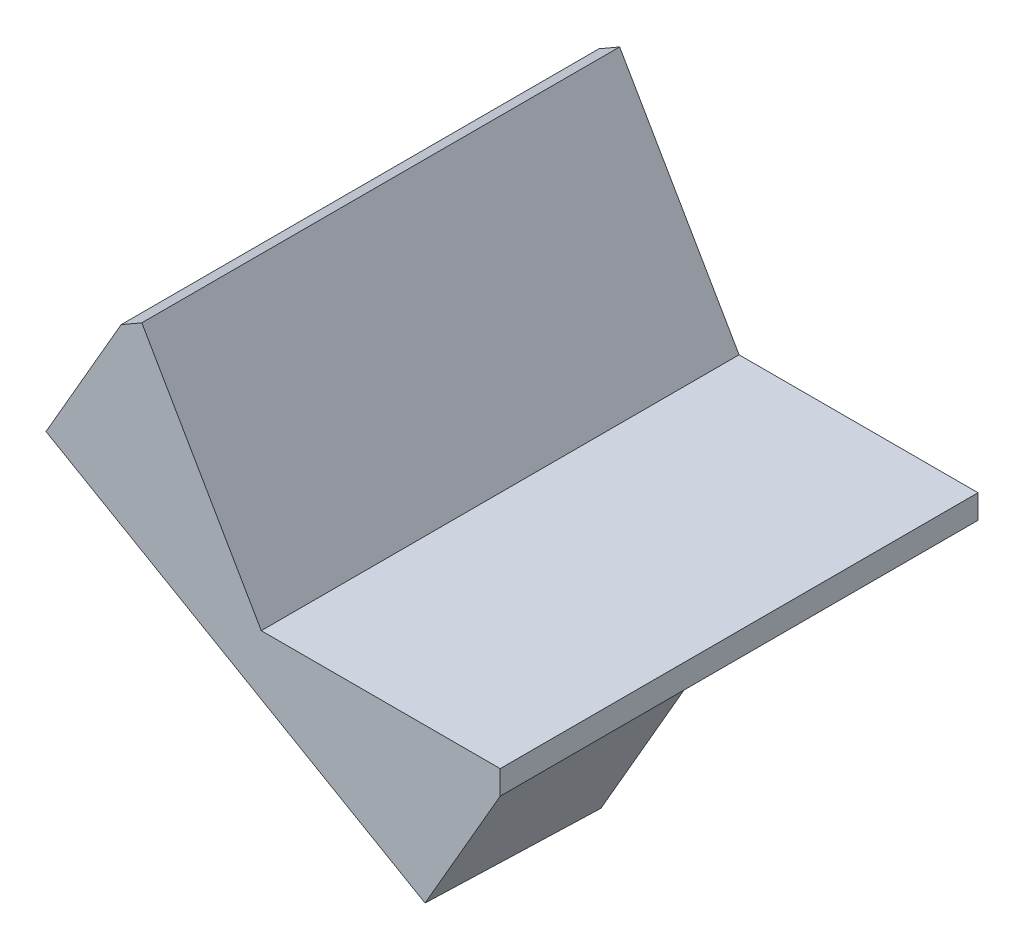
ISO-10303-21;
HEADER;
FILE_DESCRIPTION(('STEP AP214'),'2;1');
FILE_NAME('part.step','',(''),(''),'','','');
FILE_SCHEMA(('AUTOMOTIVE_DESIGN { 1 0 10303 214 1 1 1 1 }'));
ENDSEC;
DATA;
#1=APPLICATION_CONTEXT('core data for automotive mechanical design processes');
#2=APPLICATION_PROTOCOL_DEFINITION('international standard','automotive_design',2000,#1);
#3=PRODUCT_CONTEXT('',#1,'mechanical');
#4=PRODUCT('Part','Part','',(#3));
#5=PRODUCT_RELATED_PRODUCT_CATEGORY('part','',(#4));
#6=PRODUCT_DEFINITION_FORMATION('','',#4);
#7=PRODUCT_DEFINITION_CONTEXT('part definition',#1,'design');
#8=PRODUCT_DEFINITION('design','',#6,#7);
#9=PRODUCT_DEFINITION_SHAPE('','',#8);
#10=(LENGTH_UNIT() NAMED_UNIT(*) SI_UNIT(.MILLI.,.METRE.));
#11=(NAMED_UNIT(*) PLANE_ANGLE_UNIT() SI_UNIT($,.RADIAN.));
#12=(NAMED_UNIT(*) SI_UNIT($,.STERADIAN.) SOLID_ANGLE_UNIT());
#13=UNCERTAINTY_MEASURE_WITH_UNIT(LENGTH_MEASURE(1.E-05),#10,'distance_accuracy_value','');
#14=(GEOMETRIC_REPRESENTATION_CONTEXT(3) GLOBAL_UNCERTAINTY_ASSIGNED_CONTEXT((#13)) GLOBAL_UNIT_ASSIGNED_CONTEXT((#10,
#11,#12)) REPRESENTATION_CONTEXT('',''));
#15=CARTESIAN_POINT('',(0.,0.,0.));
#16=DIRECTION('',(0.,0.,1.));
#17=DIRECTION('',(1.,0.,0.));
#18=AXIS2_PLACEMENT_3D('',#15,#16,#17);
#19=CARTESIAN_POINT('',(0.,0.,40.));
#20=DIRECTION('',(0.,1.,0.));
#21=DIRECTION('',(-1.,0.,0.));
#22=AXIS2_PLACEMENT_3D('',#19,#20,#21);
#23=PLANE('',#22);
#24=DIRECTION('',(0.,0.,-1.));
#25=VECTOR('',#24,1.);
#26=CARTESIAN_POINT('',(21.1547005383792,0.,40.));
#27=LINE('',#26,#25);
#28=CARTESIAN_POINT('',(21.1547005383792,0.,24.607353742822));
#29=VERTEX_POINT('',#28);
#30=CARTESIAN_POINT('',(21.1547005383792,0.,0.));
#31=VERTEX_POINT('',#30);
#32=EDGE_CURVE('E134',#29,#31,#27,.T.);
#33=ORIENTED_EDGE('',*,*,#32,.F.);
#34=DIRECTION('',(1.,0.,0.));
#35=VECTOR('',#34,1.);
#36=CARTESIAN_POINT('',(0.,0.,24.607353742822));
#37=LINE('',#36,#35);
#38=CARTESIAN_POINT('',(0.,0.,24.607353742822));
#39=VERTEX_POINT('',#38);
#40=EDGE_CURVE('E66',#39,#29,#37,.T.);
#41=ORIENTED_EDGE('',*,*,#40,.F.);
#42=DIRECTION('',(0.,0.,-1.));
#43=VECTOR('',#42,1.);
#44=CARTESIAN_POINT('',(0.,0.,40.));
#45=LINE('',#44,#43);
#46=CARTESIAN_POINT('',(0.,0.,0.));
#47=VERTEX_POINT('',#46);
#48=EDGE_CURVE('E159',#39,#47,#45,.T.);
#49=ORIENTED_EDGE('',*,*,#48,.T.);
#50=DIRECTION('',(1.,0.,0.));
#51=VECTOR('',#50,1.);
#52=CARTESIAN_POINT('',(0.,0.,0.));
#53=LINE('',#52,#51);
#54=EDGE_CURVE('E160',#47,#31,#53,.T.);
#55=ORIENTED_EDGE('',*,*,#54,.T.);
#56=EDGE_LOOP('',(#33,#41,#49,#55));
#57=FACE_BOUND('',#56,.T.);
#58=ADVANCED_FACE('F45',(#57),#23,.F.);
#59=CARTESIAN_POINT('',(0.,0.,40.));
#60=DIRECTION('',(0.866025403784436,0.500000000000005,0.));
#61=DIRECTION('',(-0.500000000000005,0.866025403784436,0.));
#62=AXIS2_PLACEMENT_3D('',#59,#60,#61);
#63=PLANE('',#62);
#64=DIRECTION('',(0.500000000000005,-0.866025403784436,0.));
#65=VECTOR('',#64,1.);
#66=CARTESIAN_POINT('',(0.,0.,24.607353742822));
#67=LINE('',#66,#65);
#68=CARTESIAN_POINT('',(-10.5773502691897,18.3205080756887,24.607353742822));
#69=VERTEX_POINT('',#68);
#70=EDGE_CURVE('E11',#69,#39,#67,.T.);
#71=ORIENTED_EDGE('',*,*,#70,.F.);
#72=DIRECTION('',(0.,0.,-1.));
#73=VECTOR('',#72,1.);
#74=CARTESIAN_POINT('',(-10.5773502691897,18.3205080756887,40.));
#75=LINE('',#74,#73);
#76=CARTESIAN_POINT('',(-10.5773502691897,18.3205080756887,0.));
#77=VERTEX_POINT('',#76);
#78=EDGE_CURVE('E178',#69,#77,#75,.T.);
#79=ORIENTED_EDGE('',*,*,#78,.T.);
#80=DIRECTION('',(0.500000000000005,-0.866025403784436,0.));
#81=VECTOR('',#80,1.);
#82=CARTESIAN_POINT('',(0.,0.,0.));
#83=LINE('',#82,#81);
#84=EDGE_CURVE('E141',#77,#47,#83,.T.);
#85=ORIENTED_EDGE('',*,*,#84,.T.);
#86=ORIENTED_EDGE('',*,*,#48,.F.);
#87=EDGE_LOOP('',(#71,#79,#85,#86));
#88=FACE_BOUND('',#87,.T.);
#89=ADVANCED_FACE('F201',(#88),#63,.F.);
#90=CARTESIAN_POINT('',(21.1547005383792,0.,40.));
#91=DIRECTION('',(-1.,0.,0.));
#92=DIRECTION('',(0.,0.,1.));
#93=AXIS2_PLACEMENT_3D('',#90,#91,#92);
#94=PLANE('',#93);
#95=DIRECTION('',(0.,1.,0.));
#96=VECTOR('',#95,1.);
#97=CARTESIAN_POINT('',(21.1547005383792,0.,0.));
#98=LINE('',#97,#96);
#99=CARTESIAN_POINT('',(21.1547005383792,2.,0.));
#100=VERTEX_POINT('',#99);
#101=EDGE_CURVE('E164',#31,#100,#98,.T.);
#102=ORIENTED_EDGE('',*,*,#101,.T.);
#103=DIRECTION('',(0.,0.,-1.));
#104=VECTOR('',#103,1.);
#105=CARTESIAN_POINT('',(21.1547005383792,2.,40.));
#106=LINE('',#105,#104);
#107=CARTESIAN_POINT('',(21.1547005383792,2.,40.));
#108=VERTEX_POINT('',#107);
#109=EDGE_CURVE('E137',#108,#100,#106,.T.);
#110=ORIENTED_EDGE('',*,*,#109,.F.);
#111=DIRECTION('',(0.,1.,0.));
#112=VECTOR('',#111,1.);
#113=CARTESIAN_POINT('',(21.1547005383792,0.,40.));
#114=LINE('',#113,#112);
#115=CARTESIAN_POINT('',(21.1547005383792,0.,40.));
#116=VERTEX_POINT('',#115);
#117=EDGE_CURVE('E117',#116,#108,#114,.T.);
#118=ORIENTED_EDGE('',*,*,#117,.F.);
#119=EDGE_CURVE('E53',#116,#29,#27,.T.);
#120=ORIENTED_EDGE('',*,*,#119,.T.);
#121=ORIENTED_EDGE('',*,*,#32,.T.);
#122=EDGE_LOOP('',(#102,#110,#118,#120,#121));
#123=FACE_BOUND('',#122,.T.);
#124=ADVANCED_FACE('F135',(#123),#94,.F.);
#125=CARTESIAN_POINT('',(21.1547005383792,2.,40.));
#126=DIRECTION('',(0.,-1.,0.));
#127=DIRECTION('',(1.,0.,0.));
#128=AXIS2_PLACEMENT_3D('',#125,#126,#127);
#129=PLANE('',#128);
#130=DIRECTION('',(-1.,0.,0.));
#131=VECTOR('',#130,1.);
#132=CARTESIAN_POINT('',(21.1547005383792,2.,0.));
#133=LINE('',#132,#131);
#134=CARTESIAN_POINT('',(1.15470053837924,2.,0.));
#135=VERTEX_POINT('',#134);
#136=EDGE_CURVE('E167',#100,#135,#133,.T.);
#137=ORIENTED_EDGE('',*,*,#136,.T.);
#138=DIRECTION('',(0.,0.,-1.));
#139=VECTOR('',#138,1.);
#140=CARTESIAN_POINT('',(1.15470053837924,2.,40.));
#141=LINE('',#140,#139);
#142=CARTESIAN_POINT('',(1.15470053837924,2.,40.));
#143=VERTEX_POINT('',#142);
#144=EDGE_CURVE('E187',#143,#135,#141,.T.);
#145=ORIENTED_EDGE('',*,*,#144,.F.);
#146=DIRECTION('',(-1.,0.,0.));
#147=VECTOR('',#146,1.);
#148=CARTESIAN_POINT('',(21.1547005383792,2.,40.));
#149=LINE('',#148,#147);
#150=EDGE_CURVE('E140',#108,#143,#149,.T.);
#151=ORIENTED_EDGE('',*,*,#150,.F.);
#152=ORIENTED_EDGE('',*,*,#109,.T.);
#153=EDGE_LOOP('',(#137,#145,#151,#152));
#154=FACE_BOUND('',#153,.T.);
#155=ADVANCED_FACE('F213',(#154),#129,.F.);
#156=CARTESIAN_POINT('',(-8.84529946162085,19.3205080756887,40.));
#157=DIRECTION('',(-0.866025403784436,-0.500000000000004,0.));
#158=DIRECTION('',(0.500000000000004,-0.866025403784436,0.));
#159=AXIS2_PLACEMENT_3D('',#156,#157,#158);
#160=PLANE('',#159);
#161=DIRECTION('',(-0.500000000000004,0.866025403784436,0.));
#162=VECTOR('',#161,1.);
#163=CARTESIAN_POINT('',(-8.84529946162085,19.3205080756887,0.));
#164=LINE('',#163,#162);
#165=CARTESIAN_POINT('',(-8.84529946162085,19.3205080756887,0.));
#166=VERTEX_POINT('',#165);
#167=EDGE_CURVE('E170',#135,#166,#164,.T.);
#168=ORIENTED_EDGE('',*,*,#167,.T.);
#169=DIRECTION('',(0.,0.,-1.));
#170=VECTOR('',#169,1.);
#171=CARTESIAN_POINT('',(-8.84529946162085,19.3205080756887,40.));
#172=LINE('',#171,#170);
#173=CARTESIAN_POINT('',(-8.84529946162085,19.3205080756887,40.));
#174=VERTEX_POINT('',#173);
#175=EDGE_CURVE('E183',#174,#166,#172,.T.);
#176=ORIENTED_EDGE('',*,*,#175,.F.);
#177=DIRECTION('',(-0.500000000000004,0.866025403784436,0.));
#178=VECTOR('',#177,1.);
#179=CARTESIAN_POINT('',(-8.84529946162085,19.3205080756887,40.));
#180=LINE('',#179,#178);
#181=EDGE_CURVE('E145',#143,#174,#180,.T.);
#182=ORIENTED_EDGE('',*,*,#181,.F.);
#183=ORIENTED_EDGE('',*,*,#144,.T.);
#184=EDGE_LOOP('',(#168,#176,#182,#183));
#185=FACE_BOUND('',#184,.T.);
#186=ADVANCED_FACE('F211',(#185),#160,.F.);
#187=CARTESIAN_POINT('',(-10.5773502691897,18.3205080756887,40.));
#188=DIRECTION('',(0.500000000000002,-0.866025403784437,0.));
#189=DIRECTION('',(0.866025403784437,0.500000000000002,0.));
#190=AXIS2_PLACEMENT_3D('',#187,#188,#189);
#191=PLANE('',#190);
#192=DIRECTION('',(-0.866025403784437,-0.500000000000003,0.));
#193=VECTOR('',#192,1.);
#194=CARTESIAN_POINT('',(-10.5773502691897,18.3205080756887,0.));
#195=LINE('',#194,#193);
#196=EDGE_CURVE('E148',#166,#77,#195,.T.);
#197=ORIENTED_EDGE('',*,*,#196,.T.);
#198=ORIENTED_EDGE('',*,*,#78,.F.);
#199=CARTESIAN_POINT('',(-10.5773502691897,18.3205080756887,40.));
#200=VERTEX_POINT('',#199);
#201=EDGE_CURVE('E179',#200,#69,#75,.T.);
#202=ORIENTED_EDGE('',*,*,#201,.F.);
#203=DIRECTION('',(-0.866025403784437,-0.500000000000003,0.));
#204=VECTOR('',#203,1.);
#205=CARTESIAN_POINT('',(-10.5773502691897,18.3205080756887,40.));
#206=LINE('',#205,#204);
#207=EDGE_CURVE('E155',#174,#200,#206,.T.);
#208=ORIENTED_EDGE('',*,*,#207,.F.);
#209=ORIENTED_EDGE('',*,*,#175,.T.);
#210=EDGE_LOOP('',(#197,#198,#202,#208,#209));
#211=FACE_BOUND('',#210,.T.);
#212=ADVANCED_FACE('F205',(#211),#191,.F.);
#213=CARTESIAN_POINT('',(0.,0.,40.));
#214=DIRECTION('',(0.,0.,1.));
#215=DIRECTION('',(1.,0.,0.));
#216=AXIS2_PLACEMENT_3D('',#213,#214,#215);
#217=PLANE('',#216);
#218=DIRECTION('',(-0.499999999999998,-0.86602540378444,0.));
#219=VECTOR('',#218,1.);
#220=CARTESIAN_POINT('',(15.8660254037845,-9.16025403784435,40.));
#221=LINE('',#220,#219);
#222=CARTESIAN_POINT('',(14.8660254037845,-10.8923048454132,40.));
#223=VERTEX_POINT('',#222);
#224=EDGE_CURVE('E113',#116,#223,#221,.T.);
#225=ORIENTED_EDGE('',*,*,#224,.F.);
#226=ORIENTED_EDGE('',*,*,#117,.T.);
#227=ORIENTED_EDGE('',*,*,#150,.T.);
#228=ORIENTED_EDGE('',*,*,#181,.T.);
#229=ORIENTED_EDGE('',*,*,#207,.T.);
#230=DIRECTION('',(-0.499999999999998,-0.86602540378444,0.));
#231=VECTOR('',#230,1.);
#232=CARTESIAN_POINT('',(-15.8660254037845,9.16025403784436,40.));
#233=LINE('',#232,#231);
#234=CARTESIAN_POINT('',(-16.8660254037845,7.42820323027548,40.));
#235=VERTEX_POINT('',#234);
#236=EDGE_CURVE('E214',#200,#235,#233,.T.);
#237=ORIENTED_EDGE('',*,*,#236,.T.);
#238=DIRECTION('',(-0.86602540378444,0.499999999999998,0.));
#239=VECTOR('',#238,1.);
#240=CARTESIAN_POINT('',(14.8660254037845,-10.8923048454132,40.));
#241=LINE('',#240,#239);
#242=EDGE_CURVE('E120',#223,#235,#241,.T.);
#243=ORIENTED_EDGE('',*,*,#242,.F.);
#244=EDGE_LOOP('',(#225,#226,#227,#228,#229,#237,#243));
#245=FACE_BOUND('',#244,.T.);
#246=ADVANCED_FACE('F115',(#245),#217,.T.);
#247=CARTESIAN_POINT('',(0.,0.,0.));
#248=DIRECTION('',(0.,0.,1.));
#249=DIRECTION('',(1.,0.,0.));
#250=AXIS2_PLACEMENT_3D('',#247,#248,#249);
#251=PLANE('',#250);
#252=ORIENTED_EDGE('',*,*,#54,.F.);
#253=ORIENTED_EDGE('',*,*,#84,.F.);
#254=ORIENTED_EDGE('',*,*,#196,.F.);
#255=ORIENTED_EDGE('',*,*,#167,.F.);
#256=ORIENTED_EDGE('',*,*,#136,.F.);
#257=ORIENTED_EDGE('',*,*,#101,.F.);
#258=EDGE_LOOP('',(#252,#253,#254,#255,#256,#257));
#259=FACE_BOUND('',#258,.T.);
#260=ADVANCED_FACE('F198',(#259),#251,.F.);
#261=CARTESIAN_POINT('',(16.3660254037845,-8.29422863405991,24.607353742822));
#262=DIRECTION('',(0.,0.,1.));
#263=DIRECTION('',(1.,0.,0.));
#264=AXIS2_PLACEMENT_3D('',#261,#262,#263);
#265=PLANE('',#264);
#266=ORIENTED_EDGE('',*,*,#70,.T.);
#267=ORIENTED_EDGE('',*,*,#40,.T.);
#268=DIRECTION('',(0.499999999999998,0.86602540378444,0.));
#269=VECTOR('',#268,1.);
#270=CARTESIAN_POINT('',(15.1926843792006,-10.3265149032441,24.607353742822));
#271=LINE('',#270,#269);
#272=CARTESIAN_POINT('',(14.1926843792006,-12.0585657108129,24.607353742822));
#273=VERTEX_POINT('',#272);
#274=EDGE_CURVE('E131',#273,#29,#271,.T.);
#275=ORIENTED_EDGE('',*,*,#274,.F.);
#276=DIRECTION('',(-0.86602540378444,0.499999999999998,0.));
#277=VECTOR('',#276,1.);
#278=CARTESIAN_POINT('',(14.1926843792006,-12.0585657108129,24.607353742822));
#279=LINE('',#278,#277);
#280=CARTESIAN_POINT('',(-17.5393664283683,6.26194236487576,24.607353742822));
#281=VERTEX_POINT('',#280);
#282=EDGE_CURVE('E232',#273,#281,#279,.T.);
#283=ORIENTED_EDGE('',*,*,#282,.T.);
#284=DIRECTION('',(0.499999999999998,0.86602540378444,0.));
#285=VECTOR('',#284,1.);
#286=CARTESIAN_POINT('',(-16.5393664283683,7.99399317244464,24.607353742822));
#287=LINE('',#286,#285);
#288=EDGE_CURVE('E125',#281,#69,#287,.T.);
#289=ORIENTED_EDGE('',*,*,#288,.T.);
#290=EDGE_LOOP('',(#266,#267,#275,#283,#289));
#291=FACE_BOUND('',#290,.T.);
#292=ADVANCED_FACE('F238',(#291),#265,.F.);
#293=CARTESIAN_POINT('',(14.1926843792006,-12.0585657108129,24.607353742822));
#294=DIRECTION('',(0.498097349045871,0.862729915662823,-0.087155742747651));
#295=DIRECTION('',(-0.86602540378444,0.499999999999998,0.));
#296=AXIS2_PLACEMENT_3D('',#293,#294,#295);
#297=PLANE('',#296);
#298=ORIENTED_EDGE('',*,*,#242,.T.);
#299=DIRECTION('',(-0.0435778713738253,-0.0754790873051672,-0.996194698091746));
#300=VECTOR('',#299,1.);
#301=CARTESIAN_POINT('',(-17.5393664283683,6.26194236487576,24.607353742822));
#302=LINE('',#301,#300);
#303=EDGE_CURVE('E220',#235,#281,#302,.T.);
#304=ORIENTED_EDGE('',*,*,#303,.T.);
#305=ORIENTED_EDGE('',*,*,#282,.F.);
#306=DIRECTION('',(-0.0435778713738253,-0.0754790873051672,-0.996194698091746));
#307=VECTOR('',#306,1.);
#308=CARTESIAN_POINT('',(14.1926843792006,-12.0585657108129,24.607353742822));
#309=LINE('',#308,#307);
#310=EDGE_CURVE('E124',#223,#273,#309,.T.);
#311=ORIENTED_EDGE('',*,*,#310,.F.);
#312=EDGE_LOOP('',(#298,#304,#305,#311));
#313=FACE_BOUND('',#312,.T.);
#314=ADVANCED_FACE('F240',(#313),#297,.F.);
#315=CARTESIAN_POINT('',(15.8660254037845,-9.16025403784435,0.));
#316=DIRECTION('',(-0.86602540378444,0.499999999999998,0.));
#317=DIRECTION('',(-0.499999999999998,-0.86602540378444,0.));
#318=AXIS2_PLACEMENT_3D('',#315,#316,#317);
#319=PLANE('',#318);
#320=ORIENTED_EDGE('',*,*,#224,.T.);
#321=ORIENTED_EDGE('',*,*,#310,.T.);
#322=ORIENTED_EDGE('',*,*,#274,.T.);
#323=ORIENTED_EDGE('',*,*,#119,.F.);
#324=EDGE_LOOP('',(#320,#321,#322,#323));
#325=FACE_BOUND('',#324,.T.);
#326=ADVANCED_FACE('F129',(#325),#319,.F.);
#327=CARTESIAN_POINT('',(-15.8660254037845,9.16025403784436,0.));
#328=DIRECTION('',(-0.86602540378444,0.499999999999998,0.));
#329=DIRECTION('',(-0.499999999999998,-0.86602540378444,0.));
#330=AXIS2_PLACEMENT_3D('',#327,#328,#329);
#331=PLANE('',#330);
#332=ORIENTED_EDGE('',*,*,#236,.F.);
#333=ORIENTED_EDGE('',*,*,#201,.T.);
#334=ORIENTED_EDGE('',*,*,#288,.F.);
#335=ORIENTED_EDGE('',*,*,#303,.F.);
#336=EDGE_LOOP('',(#332,#333,#334,#335));
#337=FACE_BOUND('',#336,.T.);
#338=ADVANCED_FACE('F218',(#337),#331,.T.);
#339=CLOSED_SHELL('',(#58,#89,#124,#155,#186,#212,#246,#260,#292,#314,#326,#338));
#340=MANIFOLD_SOLID_BREP('B2',#339);
#341=ADVANCED_BREP_SHAPE_REPRESENTATION('',(#18,#340),#14);
#342=SHAPE_DEFINITION_REPRESENTATION(#9,#341);
ENDSEC;
END-ISO-10303-21;
